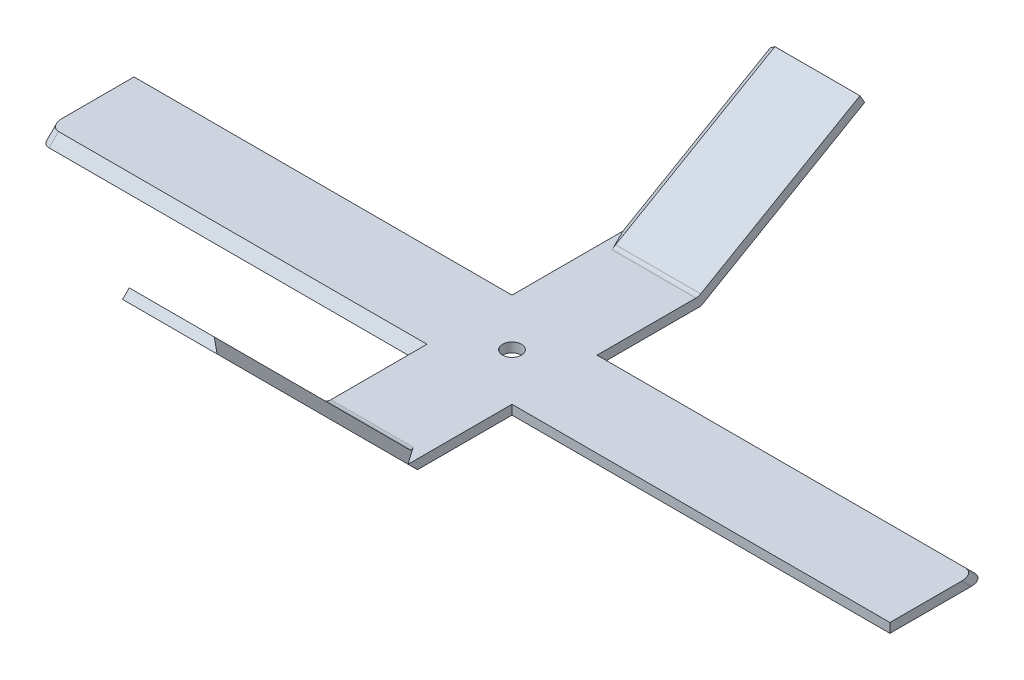
ISO-10303-21;
HEADER;
FILE_DESCRIPTION(('STEP AP214'),'2;1');
FILE_NAME('part.step','',(''),(''),'','','');
FILE_SCHEMA(('AUTOMOTIVE_DESIGN { 1 0 10303 214 1 1 1 1 }'));
ENDSEC;
DATA;
#1=APPLICATION_CONTEXT('core data for automotive mechanical design processes');
#2=APPLICATION_PROTOCOL_DEFINITION('international standard','automotive_design',2000,#1);
#3=PRODUCT_CONTEXT('',#1,'mechanical');
#4=PRODUCT('Part','Part','',(#3));
#5=PRODUCT_RELATED_PRODUCT_CATEGORY('part','',(#4));
#6=PRODUCT_DEFINITION_FORMATION('','',#4);
#7=PRODUCT_DEFINITION_CONTEXT('part definition',#1,'design');
#8=PRODUCT_DEFINITION('design','',#6,#7);
#9=PRODUCT_DEFINITION_SHAPE('','',#8);
#10=(LENGTH_UNIT() NAMED_UNIT(*) SI_UNIT(.MILLI.,.METRE.));
#11=(NAMED_UNIT(*) PLANE_ANGLE_UNIT() SI_UNIT($,.RADIAN.));
#12=(NAMED_UNIT(*) SI_UNIT($,.STERADIAN.) SOLID_ANGLE_UNIT());
#13=UNCERTAINTY_MEASURE_WITH_UNIT(LENGTH_MEASURE(1.E-05),#10,'distance_accuracy_value','');
#14=(GEOMETRIC_REPRESENTATION_CONTEXT(3) GLOBAL_UNCERTAINTY_ASSIGNED_CONTEXT((#13)) GLOBAL_UNIT_ASSIGNED_CONTEXT((#10,
#11,#12)) REPRESENTATION_CONTEXT('',''));
#15=CARTESIAN_POINT('',(0.,0.,0.));
#16=DIRECTION('',(0.,0.,1.));
#17=DIRECTION('',(1.,0.,0.));
#18=AXIS2_PLACEMENT_3D('',#15,#16,#17);
#19=CARTESIAN_POINT('',(10.,0.,0.));
#20=DIRECTION('',(-1.,0.,0.));
#21=DIRECTION('',(0.,0.,1.));
#22=AXIS2_PLACEMENT_3D('',#19,#20,#21);
#23=PLANE('',#22);
#24=DIRECTION('',(0.,0.,1.));
#25=VECTOR('',#24,1.);
#26=CARTESIAN_POINT('',(10.,1.,13.8404448227201));
#27=LINE('',#26,#25);
#28=CARTESIAN_POINT('',(10.,1.,4.25465838509315));
#29=VERTEX_POINT('',#28);
#30=CARTESIAN_POINT('',(10.,1.,15.2546583850932));
#31=VERTEX_POINT('',#30);
#32=EDGE_CURVE('E199',#29,#31,#27,.T.);
#33=ORIENTED_EDGE('',*,*,#32,.T.);
#34=DIRECTION('',(0.,-0.707106781186544,-0.707106781186551));
#35=VECTOR('',#34,1.);
#36=CARTESIAN_POINT('',(10.,0.,14.2546583850932));
#37=LINE('',#36,#35);
#38=CARTESIAN_POINT('',(10.,0.,14.2546583850932));
#39=VERTEX_POINT('',#38);
#40=EDGE_CURVE('E383',#31,#39,#37,.T.);
#41=ORIENTED_EDGE('',*,*,#40,.T.);
#42=DIRECTION('',(0.,0.,-1.));
#43=VECTOR('',#42,1.);
#44=CARTESIAN_POINT('',(10.,0.,14.2546583850932));
#45=LINE('',#44,#43);
#46=CARTESIAN_POINT('',(10.,0.,4.25465838509315));
#47=VERTEX_POINT('',#46);
#48=EDGE_CURVE('E316',#39,#47,#45,.T.);
#49=ORIENTED_EDGE('',*,*,#48,.T.);
#50=DIRECTION('',(0.,-1.,0.));
#51=VECTOR('',#50,1.);
#52=CARTESIAN_POINT('',(10.,1.,4.25465838509315));
#53=LINE('',#52,#51);
#54=EDGE_CURVE('E193',#29,#47,#53,.T.);
#55=ORIENTED_EDGE('',*,*,#54,.F.);
#56=EDGE_LOOP('',(#33,#41,#49,#55));
#57=FACE_BOUND('',#56,.T.);
#58=ADVANCED_FACE('F32',(#57),#23,.F.);
#59=CARTESIAN_POINT('',(0.,0.,0.));
#60=DIRECTION('',(-1.,0.,0.));
#61=DIRECTION('',(0.,0.,1.));
#62=AXIS2_PLACEMENT_3D('',#59,#60,#61);
#63=PLANE('',#62);
#64=DIRECTION('',(0.,0.,1.));
#65=VECTOR('',#64,1.);
#66=CARTESIAN_POINT('',(0.,1.,13.8404448227201));
#67=LINE('',#66,#65);
#68=CARTESIAN_POINT('',(0.,1.,3.25465838509315));
#69=VERTEX_POINT('',#68);
#70=CARTESIAN_POINT('',(0.,1.,13.426231260347));
#71=VERTEX_POINT('',#70);
#72=EDGE_CURVE('E359',#69,#71,#67,.T.);
#73=ORIENTED_EDGE('',*,*,#72,.F.);
#74=DIRECTION('',(0.,-0.707106781186543,0.707106781186553));
#75=VECTOR('',#74,1.);
#76=CARTESIAN_POINT('',(0.,0.,4.25465838509315));
#77=LINE('',#76,#75);
#78=CARTESIAN_POINT('',(0.,0.,4.25465838509315));
#79=VERTEX_POINT('',#78);
#80=EDGE_CURVE('E226',#69,#79,#77,.T.);
#81=ORIENTED_EDGE('',*,*,#80,.T.);
#82=DIRECTION('',(0.,0.,-1.));
#83=VECTOR('',#82,1.);
#84=CARTESIAN_POINT('',(0.,0.,14.2546583850932));
#85=LINE('',#84,#83);
#86=CARTESIAN_POINT('',(0.,0.,14.2546583850932));
#87=VERTEX_POINT('',#86);
#88=EDGE_CURVE('E375',#87,#79,#85,.T.);
#89=ORIENTED_EDGE('',*,*,#88,.F.);
#90=DIRECTION('',(0.,-0.707106781186544,-0.707106781186551));
#91=VECTOR('',#90,1.);
#92=CARTESIAN_POINT('',(0.,0.,14.2546583850932));
#93=LINE('',#92,#91);
#94=CARTESIAN_POINT('',(0.,21.2132034355963,35.4678618206897));
#95=VERTEX_POINT('',#94);
#96=EDGE_CURVE('E274',#95,#87,#93,.T.);
#97=ORIENTED_EDGE('',*,*,#96,.F.);
#98=DIRECTION('',(0.,-0.707106781186556,0.707106781186539));
#99=VECTOR('',#98,1.);
#100=CARTESIAN_POINT('',(0.,21.2132034355963,35.4678618206897));
#101=LINE('',#100,#99);
#102=CARTESIAN_POINT('',(0.,21.9203102167829,34.7607550395032));
#103=VERTEX_POINT('',#102);
#104=EDGE_CURVE('E381',#103,#95,#101,.T.);
#105=ORIENTED_EDGE('',*,*,#104,.F.);
#106=DIRECTION('',(0.,0.707106781186544,0.707106781186551));
#107=VECTOR('',#106,1.);
#108=CARTESIAN_POINT('',(0.,1.,13.8404448227201));
#109=LINE('',#108,#107);
#110=CARTESIAN_POINT('',(0.,1.29289321881345,14.1333380415335));
#111=VERTEX_POINT('',#110);
#112=EDGE_CURVE('E362',#111,#103,#109,.T.);
#113=ORIENTED_EDGE('',*,*,#112,.F.);
#114=CARTESIAN_POINT('',(0.,2.,13.426231260347));
#115=DIRECTION('',(-1.,0.,0.));
#116=DIRECTION('',(0.,0.,1.));
#117=AXIS2_PLACEMENT_3D('',#114,#115,#116);
#118=CIRCLE('',#117,1.);
#119=EDGE_CURVE('E338',#111,#71,#118,.F.);
#120=ORIENTED_EDGE('',*,*,#119,.T.);
#121=EDGE_LOOP('',(#73,#81,#89,#97,#105,#113,#120));
#122=FACE_BOUND('',#121,.T.);
#123=ADVANCED_FACE('F358',(#122),#63,.T.);
#124=CARTESIAN_POINT('',(10.,0.,14.2546583850932));
#125=DIRECTION('',(0.,0.707106781186551,-0.707106781186544));
#126=DIRECTION('',(0.,0.707106781186544,0.707106781186551));
#127=AXIS2_PLACEMENT_3D('',#124,#125,#126);
#128=PLANE('',#127);
#129=ORIENTED_EDGE('',*,*,#96,.T.);
#130=DIRECTION('',(-1.,0.,0.));
#131=VECTOR('',#130,1.);
#132=CARTESIAN_POINT('',(10.,0.,14.2546583850932));
#133=LINE('',#132,#131);
#134=EDGE_CURVE('E215',#39,#87,#133,.T.);
#135=ORIENTED_EDGE('',*,*,#134,.F.);
#136=ORIENTED_EDGE('',*,*,#40,.F.);
#137=CARTESIAN_POINT('',(10.,21.2132034355963,35.4678618206897));
#138=VERTEX_POINT('',#137);
#139=EDGE_CURVE('E321',#138,#31,#37,.T.);
#140=ORIENTED_EDGE('',*,*,#139,.F.);
#141=DIRECTION('',(-1.,0.,0.));
#142=VECTOR('',#141,1.);
#143=CARTESIAN_POINT('',(10.,21.2132034355963,35.4678618206897));
#144=LINE('',#143,#142);
#145=EDGE_CURVE('E267',#138,#95,#144,.T.);
#146=ORIENTED_EDGE('',*,*,#145,.T.);
#147=EDGE_LOOP('',(#129,#135,#136,#140,#146));
#148=FACE_BOUND('',#147,.T.);
#149=ADVANCED_FACE('F405',(#148),#128,.F.);
#150=CARTESIAN_POINT('',(10.,0.,14.2546583850932));
#151=DIRECTION('',(0.,1.,0.));
#152=DIRECTION('',(0.,0.,1.));
#153=AXIS2_PLACEMENT_3D('',#150,#151,#152);
#154=PLANE('',#153);
#155=CARTESIAN_POINT('',(5.,0.,-0.745341614906845));
#156=DIRECTION('',(0.,-1.,0.));
#157=DIRECTION('',(0.,0.,-1.));
#158=AXIS2_PLACEMENT_3D('',#155,#156,#157);
#159=CIRCLE('',#158,1.);
#160=CARTESIAN_POINT('',(5.,0.,-1.74534161490685));
#161=VERTEX_POINT('',#160);
#162=EDGE_CURVE('E260',#161,#161,#159,.T.);
#163=ORIENTED_EDGE('',*,*,#162,.F.);
#164=EDGE_LOOP('',(#163));
#165=FACE_BOUND('',#164,.T.);
#166=DIRECTION('',(1.,0.,0.));
#167=VECTOR('',#166,1.);
#168=CARTESIAN_POINT('',(50.,0.,-5.74534161490684));
#169=LINE('',#168,#167);
#170=CARTESIAN_POINT('',(10.,0.,-5.74534161490684));
#171=VERTEX_POINT('',#170);
#172=CARTESIAN_POINT('',(49.,0.,-5.74534161490684));
#173=VERTEX_POINT('',#172);
#174=EDGE_CURVE('E259',#171,#173,#169,.T.);
#175=ORIENTED_EDGE('',*,*,#174,.T.);
#176=CARTESIAN_POINT('',(49.,0.,-4.33112805253374));
#177=DIRECTION('',(0.,1.,0.));
#178=DIRECTION('',(0.,0.,1.));
#179=AXIS2_PLACEMENT_3D('',#176,#177,#178);
#180=ELLIPSE('',#179,1.41421356237311,1.);
#181=CARTESIAN_POINT('',(50.,0.,-4.33112805253374));
#182=VERTEX_POINT('',#181);
#183=EDGE_CURVE('E248',#173,#182,#180,.F.);
#184=ORIENTED_EDGE('',*,*,#183,.T.);
#185=DIRECTION('',(0.,0.,1.));
#186=VECTOR('',#185,1.);
#187=CARTESIAN_POINT('',(50.,0.,4.25465838509315));
#188=LINE('',#187,#186);
#189=CARTESIAN_POINT('',(50.,0.,4.25465838509315));
#190=VERTEX_POINT('',#189);
#191=EDGE_CURVE('E208',#182,#190,#188,.T.);
#192=ORIENTED_EDGE('',*,*,#191,.T.);
#193=DIRECTION('',(-1.,0.,0.));
#194=VECTOR('',#193,1.);
#195=CARTESIAN_POINT('',(10.,0.,4.25465838509315));
#196=LINE('',#195,#194);
#197=EDGE_CURVE('E187',#190,#47,#196,.T.);
#198=ORIENTED_EDGE('',*,*,#197,.T.);
#199=ORIENTED_EDGE('',*,*,#48,.F.);
#200=ORIENTED_EDGE('',*,*,#134,.T.);
#201=ORIENTED_EDGE('',*,*,#88,.T.);
#202=DIRECTION('',(-1.,0.,0.));
#203=VECTOR('',#202,1.);
#204=CARTESIAN_POINT('',(-40.,0.,4.25465838509315));
#205=LINE('',#204,#203);
#206=CARTESIAN_POINT('',(-39.,0.,4.25465838509315));
#207=VERTEX_POINT('',#206);
#208=EDGE_CURVE('E299',#79,#207,#205,.T.);
#209=ORIENTED_EDGE('',*,*,#208,.T.);
#210=CARTESIAN_POINT('',(-39.,0.,2.84044482272006));
#211=DIRECTION('',(0.,1.,0.));
#212=DIRECTION('',(0.,0.,-1.));
#213=AXIS2_PLACEMENT_3D('',#210,#211,#212);
#214=ELLIPSE('',#213,1.4142135623731,1.);
#215=CARTESIAN_POINT('',(-40.,0.,2.84044482272006));
#216=VERTEX_POINT('',#215);
#217=EDGE_CURVE('E246',#207,#216,#214,.F.);
#218=ORIENTED_EDGE('',*,*,#217,.T.);
#219=DIRECTION('',(0.,0.,-1.));
#220=VECTOR('',#219,1.);
#221=CARTESIAN_POINT('',(-40.,0.,-5.74534161490685));
#222=LINE('',#221,#220);
#223=CARTESIAN_POINT('',(-40.,0.,-5.74534161490685));
#224=VERTEX_POINT('',#223);
#225=EDGE_CURVE('E297',#216,#224,#222,.T.);
#226=ORIENTED_EDGE('',*,*,#225,.T.);
#227=DIRECTION('',(1.,0.,0.));
#228=VECTOR('',#227,1.);
#229=CARTESIAN_POINT('',(0.,0.,-5.74534161490684));
#230=LINE('',#229,#228);
#231=CARTESIAN_POINT('',(0.,0.,-5.74534161490684));
#232=VERTEX_POINT('',#231);
#233=EDGE_CURVE('E296',#224,#232,#230,.T.);
#234=ORIENTED_EDGE('',*,*,#233,.T.);
#235=CARTESIAN_POINT('',(0.,0.,-15.7453416149068));
#236=VERTEX_POINT('',#235);
#237=EDGE_CURVE('E408',#232,#236,#85,.T.);
#238=ORIENTED_EDGE('',*,*,#237,.T.);
#239=DIRECTION('',(-1.,0.,0.));
#240=VECTOR('',#239,1.);
#241=CARTESIAN_POINT('',(10.,0.,-15.7453416149068));
#242=LINE('',#241,#240);
#243=CARTESIAN_POINT('',(10.,0.,-15.7453416149068));
#244=VERTEX_POINT('',#243);
#245=EDGE_CURVE('E392',#244,#236,#242,.T.);
#246=ORIENTED_EDGE('',*,*,#245,.F.);
#247=EDGE_CURVE('E280',#171,#244,#45,.T.);
#248=ORIENTED_EDGE('',*,*,#247,.F.);
#249=EDGE_LOOP('',(#175,#184,#192,#198,#199,#200,#201,#209,#218,#226,#234,#238,#246,#248));
#250=FACE_BOUND('',#249,.T.);
#251=ADVANCED_FACE('F399',(#165,#250),#154,.F.);
#252=CARTESIAN_POINT('',(10.,0.,-15.7453416149068));
#253=DIRECTION('',(0.,0.866025403784438,0.500000000000001));
#254=DIRECTION('',(0.,-0.500000000000001,0.866025403784438));
#255=AXIS2_PLACEMENT_3D('',#252,#253,#254);
#256=PLANE('',#255);
#257=DIRECTION('',(0.,0.500000000000001,-0.866025403784438));
#258=VECTOR('',#257,1.);
#259=CARTESIAN_POINT('',(0.,0.,-15.7453416149068));
#260=LINE('',#259,#258);
#261=CARTESIAN_POINT('',(0.,0.999999999999997,-17.4773924224757));
#262=VERTEX_POINT('',#261);
#263=EDGE_CURVE('E365',#236,#262,#260,.T.);
#264=ORIENTED_EDGE('',*,*,#263,.T.);
#265=CARTESIAN_POINT('',(0.,10.,-33.0658496905956));
#266=VERTEX_POINT('',#265);
#267=EDGE_CURVE('E370',#262,#266,#260,.T.);
#268=ORIENTED_EDGE('',*,*,#267,.T.);
#269=DIRECTION('',(-1.,0.,0.));
#270=VECTOR('',#269,1.);
#271=CARTESIAN_POINT('',(10.,10.,-33.0658496905956));
#272=LINE('',#271,#270);
#273=CARTESIAN_POINT('',(10.,10.,-33.0658496905956));
#274=VERTEX_POINT('',#273);
#275=EDGE_CURVE('E389',#274,#266,#272,.T.);
#276=ORIENTED_EDGE('',*,*,#275,.F.);
#277=DIRECTION('',(0.,0.500000000000001,-0.866025403784438));
#278=VECTOR('',#277,1.);
#279=CARTESIAN_POINT('',(10.,0.,-15.7453416149068));
#280=LINE('',#279,#278);
#281=EDGE_CURVE('E318',#244,#274,#280,.T.);
#282=ORIENTED_EDGE('',*,*,#281,.F.);
#283=ORIENTED_EDGE('',*,*,#245,.T.);
#284=EDGE_LOOP('',(#264,#268,#276,#282,#283));
#285=FACE_BOUND('',#284,.T.);
#286=ADVANCED_FACE('F420',(#285),#256,.F.);
#287=CARTESIAN_POINT('',(10.,10.8660254037844,-32.5658496905956));
#288=DIRECTION('',(0.,-0.499999999999999,0.866025403784439));
#289=DIRECTION('',(0.,-0.866025403784439,-0.499999999999999));
#290=AXIS2_PLACEMENT_3D('',#287,#288,#289);
#291=PLANE('',#290);
#292=ORIENTED_EDGE('',*,*,#275,.T.);
#293=DIRECTION('',(0.707106781186545,0.612372435695797,0.353553390593275));
#294=VECTOR('',#293,1.);
#295=CARTESIAN_POINT('',(0.999999999999978,10.8660254037844,-32.5658496905956));
#296=LINE('',#295,#294);
#297=CARTESIAN_POINT('',(0.999999999999988,10.8660254037844,-32.5658496905956));
#298=VERTEX_POINT('',#297);
#299=EDGE_CURVE('E219',#266,#298,#296,.T.);
#300=ORIENTED_EDGE('',*,*,#299,.T.);
#301=DIRECTION('',(-1.,0.,0.));
#302=VECTOR('',#301,1.);
#303=CARTESIAN_POINT('',(10.,10.8660254037844,-32.5658496905956));
#304=LINE('',#303,#302);
#305=CARTESIAN_POINT('',(10.,10.8660254037844,-32.5658496905956));
#306=VERTEX_POINT('',#305);
#307=EDGE_CURVE('E387',#306,#298,#304,.T.);
#308=ORIENTED_EDGE('',*,*,#307,.F.);
#309=DIRECTION('',(0.,0.866025403784439,0.499999999999999));
#310=VECTOR('',#309,1.);
#311=CARTESIAN_POINT('',(10.,10.8660254037844,-32.5658496905956));
#312=LINE('',#311,#310);
#313=EDGE_CURVE('E323',#274,#306,#312,.T.);
#314=ORIENTED_EDGE('',*,*,#313,.F.);
#315=EDGE_LOOP('',(#292,#300,#308,#314));
#316=FACE_BOUND('',#315,.T.);
#317=ADVANCED_FACE('F424',(#316),#291,.F.);
#318=CARTESIAN_POINT('',(10.,1.,-15.4773924224757));
#319=DIRECTION('',(0.,-0.866025403784439,-0.5));
#320=DIRECTION('',(0.,0.5,-0.866025403784439));
#321=AXIS2_PLACEMENT_3D('',#318,#319,#320);
#322=PLANE('',#321);
#323=DIRECTION('',(0.,-0.5,0.866025403784439));
#324=VECTOR('',#323,1.);
#325=CARTESIAN_POINT('',(0.999999999999987,0.999999999999999,-15.4773924224757));
#326=LINE('',#325,#324);
#327=CARTESIAN_POINT('',(0.999999999999987,1.13397459621556,-15.7094432300446));
#328=VERTEX_POINT('',#327);
#329=EDGE_CURVE('E217',#298,#328,#326,.T.);
#330=ORIENTED_EDGE('',*,*,#329,.T.);
#331=DIRECTION('',(-1.,0.,0.));
#332=VECTOR('',#331,1.);
#333=CARTESIAN_POINT('',(10.,1.13397459621556,-15.7094432300446));
#334=LINE('',#333,#332);
#335=CARTESIAN_POINT('',(10.,1.13397459621556,-15.7094432300446));
#336=VERTEX_POINT('',#335);
#337=EDGE_CURVE('E47',#328,#336,#334,.F.);
#338=ORIENTED_EDGE('',*,*,#337,.T.);
#339=DIRECTION('',(0.,-0.5,0.866025403784438));
#340=VECTOR('',#339,1.);
#341=CARTESIAN_POINT('',(10.,1.,-15.4773924224757));
#342=LINE('',#341,#340);
#343=EDGE_CURVE('E272',#306,#336,#342,.T.);
#344=ORIENTED_EDGE('',*,*,#343,.F.);
#345=ORIENTED_EDGE('',*,*,#307,.T.);
#346=EDGE_LOOP('',(#330,#338,#344,#345));
#347=FACE_BOUND('',#346,.T.);
#348=ADVANCED_FACE('F425',(#347),#322,.F.);
#349=CARTESIAN_POINT('',(10.,1.,13.8404448227201));
#350=DIRECTION('',(0.,-1.,0.));
#351=DIRECTION('',(0.,0.,-1.));
#352=AXIS2_PLACEMENT_3D('',#349,#350,#351);
#353=PLANE('',#352);
#354=CARTESIAN_POINT('',(5.,1.,-0.745341614906845));
#355=DIRECTION('',(0.,-1.,0.));
#356=DIRECTION('',(0.,0.,-1.));
#357=AXIS2_PLACEMENT_3D('',#354,#355,#356);
#358=CIRCLE('',#357,1.);
#359=CARTESIAN_POINT('',(5.,1.,-1.74534161490685));
#360=VERTEX_POINT('',#359);
#361=EDGE_CURVE('E256',#360,#360,#358,.T.);
#362=ORIENTED_EDGE('',*,*,#361,.T.);
#363=EDGE_LOOP('',(#362));
#364=FACE_BOUND('',#363,.T.);
#365=ORIENTED_EDGE('',*,*,#72,.T.);
#366=DIRECTION('',(-1.,0.,0.));
#367=VECTOR('',#366,1.);
#368=CARTESIAN_POINT('',(9.,1.,13.426231260347));
#369=LINE('',#368,#367);
#370=CARTESIAN_POINT('',(8.70710678118655,1.,13.426231260347));
#371=VERTEX_POINT('',#370);
#372=EDGE_CURVE('E334',#71,#371,#369,.F.);
#373=ORIENTED_EDGE('',*,*,#372,.T.);
#374=DIRECTION('',(-0.577350269189623,0.,-0.816496580927728));
#375=VECTOR('',#374,1.);
#376=CARTESIAN_POINT('',(9.33333333333333,1.,14.3118493435111));
#377=LINE('',#376,#375);
#378=EDGE_CURVE('E235',#371,#31,#377,.F.);
#379=ORIENTED_EDGE('',*,*,#378,.T.);
#380=ORIENTED_EDGE('',*,*,#32,.F.);
#381=DIRECTION('',(-1.,0.,0.));
#382=VECTOR('',#381,1.);
#383=CARTESIAN_POINT('',(10.,1.,4.25465838509315));
#384=LINE('',#383,#382);
#385=CARTESIAN_POINT('',(50.,1.,4.25465838509315));
#386=VERTEX_POINT('',#385);
#387=EDGE_CURVE('E186',#386,#29,#384,.T.);
#388=ORIENTED_EDGE('',*,*,#387,.F.);
#389=DIRECTION('',(0.,0.,1.));
#390=VECTOR('',#389,1.);
#391=CARTESIAN_POINT('',(50.,1.,4.25465838509315));
#392=LINE('',#391,#390);
#393=CARTESIAN_POINT('',(50.,1.,-3.33112805253373));
#394=VERTEX_POINT('',#393);
#395=EDGE_CURVE('E176',#394,#386,#392,.T.);
#396=ORIENTED_EDGE('',*,*,#395,.F.);
#397=CARTESIAN_POINT('',(49.,1.,-3.33112805253373));
#398=DIRECTION('',(0.,-1.,0.));
#399=DIRECTION('',(0.,0.,1.));
#400=AXIS2_PLACEMENT_3D('',#397,#398,#399);
#401=ELLIPSE('',#400,1.41421356237311,1.);
#402=CARTESIAN_POINT('',(49.,1.,-4.74534161490683));
#403=VERTEX_POINT('',#402);
#404=EDGE_CURVE('E242',#394,#403,#401,.F.);
#405=ORIENTED_EDGE('',*,*,#404,.T.);
#406=DIRECTION('',(-1.,0.,0.));
#407=VECTOR('',#406,1.);
#408=CARTESIAN_POINT('',(10.,1.,-4.74534161490684));
#409=LINE('',#408,#407);
#410=CARTESIAN_POINT('',(10.,1.,-4.74534161490684));
#411=VERTEX_POINT('',#410);
#412=EDGE_CURVE('E211',#403,#411,#409,.T.);
#413=ORIENTED_EDGE('',*,*,#412,.T.);
#414=CARTESIAN_POINT('',(10.,1.,-15.2094432300446));
#415=VERTEX_POINT('',#414);
#416=EDGE_CURVE('E264',#415,#411,#27,.T.);
#417=ORIENTED_EDGE('',*,*,#416,.F.);
#418=DIRECTION('',(-1.,0.,0.));
#419=VECTOR('',#418,1.);
#420=CARTESIAN_POINT('',(0.999999999999987,1.,-15.2094432300446));
#421=LINE('',#420,#419);
#422=CARTESIAN_POINT('',(1.13397459621554,1.,-15.2094432300446));
#423=VERTEX_POINT('',#422);
#424=EDGE_CURVE('E263',#415,#423,#421,.T.);
#425=ORIENTED_EDGE('',*,*,#424,.T.);
#426=DIRECTION('',(-0.447213595499956,0.,-0.894427190999917));
#427=VECTOR('',#426,1.);
#428=CARTESIAN_POINT('',(14.5271348980782,1.,11.576877373681));
#429=LINE('',#428,#427);
#430=EDGE_CURVE('E228',#423,#262,#429,.T.);
#431=ORIENTED_EDGE('',*,*,#430,.T.);
#432=CARTESIAN_POINT('',(0.,1.,-5.74534161490684));
#433=VERTEX_POINT('',#432);
#434=EDGE_CURVE('E364',#262,#433,#67,.T.);
#435=ORIENTED_EDGE('',*,*,#434,.T.);
#436=DIRECTION('',(1.,0.,0.));
#437=VECTOR('',#436,1.);
#438=CARTESIAN_POINT('',(0.,1.,-5.74534161490684));
#439=LINE('',#438,#437);
#440=CARTESIAN_POINT('',(-40.,1.,-5.74534161490685));
#441=VERTEX_POINT('',#440);
#442=EDGE_CURVE('E295',#441,#433,#439,.T.);
#443=ORIENTED_EDGE('',*,*,#442,.F.);
#444=DIRECTION('',(0.,0.,-1.));
#445=VECTOR('',#444,1.);
#446=CARTESIAN_POINT('',(-40.,1.,-5.74534161490685));
#447=LINE('',#446,#445);
#448=CARTESIAN_POINT('',(-40.,1.,1.84044482272004));
#449=VERTEX_POINT('',#448);
#450=EDGE_CURVE('E293',#449,#441,#447,.T.);
#451=ORIENTED_EDGE('',*,*,#450,.F.);
#452=CARTESIAN_POINT('',(-39.,1.,1.84044482272004));
#453=DIRECTION('',(0.,-1.,0.));
#454=DIRECTION('',(0.,0.,-1.));
#455=AXIS2_PLACEMENT_3D('',#452,#453,#454);
#456=ELLIPSE('',#455,1.4142135623731,1.);
#457=CARTESIAN_POINT('',(-39.,1.,3.25465838509315));
#458=VERTEX_POINT('',#457);
#459=EDGE_CURVE('E240',#449,#458,#456,.F.);
#460=ORIENTED_EDGE('',*,*,#459,.T.);
#461=DIRECTION('',(1.,0.,0.));
#462=VECTOR('',#461,1.);
#463=CARTESIAN_POINT('',(0.,1.,3.25465838509315));
#464=LINE('',#463,#462);
#465=EDGE_CURVE('E214',#458,#69,#464,.T.);
#466=ORIENTED_EDGE('',*,*,#465,.T.);
#467=EDGE_LOOP('',(#365,#373,#379,#380,#388,#396,#405,#413,#417,#425,#431,#435,#443,#451,#460,#466));
#468=FACE_BOUND('',#467,.T.);
#469=ADVANCED_FACE('F197',(#364,#468),#353,.F.);
#470=CARTESIAN_POINT('',(10.,1.,13.8404448227201));
#471=DIRECTION('',(0.,-0.707106781186551,0.707106781186544));
#472=DIRECTION('',(0.,-0.707106781186544,-0.707106781186551));
#473=AXIS2_PLACEMENT_3D('',#470,#471,#472);
#474=PLANE('',#473);
#475=DIRECTION('',(0.,-0.707106781186544,-0.707106781186551));
#476=VECTOR('',#475,1.);
#477=CARTESIAN_POINT('',(9.,1.,13.8404448227201));
#478=LINE('',#477,#476);
#479=CARTESIAN_POINT('',(9.,21.9203102167829,34.7607550395032));
#480=VERTEX_POINT('',#479);
#481=CARTESIAN_POINT('',(9.,1.29289321881345,14.1333380415335));
#482=VERTEX_POINT('',#481);
#483=EDGE_CURVE('E223',#480,#482,#478,.T.);
#484=ORIENTED_EDGE('',*,*,#483,.T.);
#485=DIRECTION('',(-1.,0.,0.));
#486=VECTOR('',#485,1.);
#487=CARTESIAN_POINT('',(0.,1.29289321881345,14.1333380415335));
#488=LINE('',#487,#486);
#489=EDGE_CURVE('E255',#482,#111,#488,.T.);
#490=ORIENTED_EDGE('',*,*,#489,.T.);
#491=ORIENTED_EDGE('',*,*,#112,.T.);
#492=DIRECTION('',(-1.,0.,0.));
#493=VECTOR('',#492,1.);
#494=CARTESIAN_POINT('',(10.,21.9203102167829,34.7607550395032));
#495=LINE('',#494,#493);
#496=EDGE_CURVE('E354',#480,#103,#495,.T.);
#497=ORIENTED_EDGE('',*,*,#496,.F.);
#498=EDGE_LOOP('',(#484,#490,#491,#497));
#499=FACE_BOUND('',#498,.T.);
#500=ADVANCED_FACE('F351',(#499),#474,.F.);
#501=CARTESIAN_POINT('',(10.,21.2132034355963,35.4678618206897));
#502=DIRECTION('',(0.,-0.707106781186539,-0.707106781186556));
#503=DIRECTION('',(0.,0.707106781186556,-0.707106781186539));
#504=AXIS2_PLACEMENT_3D('',#501,#502,#503);
#505=PLANE('',#504);
#506=ORIENTED_EDGE('',*,*,#145,.F.);
#507=DIRECTION('',(0.707106781186547,-0.500000000000007,0.499999999999995));
#508=VECTOR('',#507,1.);
#509=CARTESIAN_POINT('',(10.0000000000001,21.2132034355962,35.4678618206898));
#510=LINE('',#509,#508);
#511=EDGE_CURVE('E221',#138,#480,#510,.F.);
#512=ORIENTED_EDGE('',*,*,#511,.T.);
#513=ORIENTED_EDGE('',*,*,#496,.T.);
#514=ORIENTED_EDGE('',*,*,#104,.T.);
#515=EDGE_LOOP('',(#506,#512,#513,#514));
#516=FACE_BOUND('',#515,.T.);
#517=ADVANCED_FACE('F466',(#516),#505,.F.);
#518=ORIENTED_EDGE('',*,*,#343,.T.);
#519=CARTESIAN_POINT('',(10.,2.,-15.2094432300446));
#520=DIRECTION('',(-1.,0.,0.));
#521=DIRECTION('',(0.,0.,1.));
#522=AXIS2_PLACEMENT_3D('',#519,#520,#521);
#523=CIRCLE('',#522,1.);
#524=EDGE_CURVE('E11',#336,#415,#523,.T.);
#525=ORIENTED_EDGE('',*,*,#524,.T.);
#526=ORIENTED_EDGE('',*,*,#416,.T.);
#527=DIRECTION('',(0.,-0.707106781186542,-0.707106781186553));
#528=VECTOR('',#527,1.);
#529=CARTESIAN_POINT('',(10.,2.87267080745343,-2.87267080745338));
#530=LINE('',#529,#528);
#531=EDGE_CURVE('E233',#411,#171,#530,.T.);
#532=ORIENTED_EDGE('',*,*,#531,.T.);
#533=ORIENTED_EDGE('',*,*,#247,.T.);
#534=ORIENTED_EDGE('',*,*,#281,.T.);
#535=ORIENTED_EDGE('',*,*,#313,.T.);
#536=EDGE_LOOP('',(#518,#525,#526,#532,#533,#534,#535));
#537=FACE_BOUND('',#536,.T.);
#538=ADVANCED_FACE('F328',(#537),#23,.F.);
#539=ORIENTED_EDGE('',*,*,#434,.F.);
#540=ORIENTED_EDGE('',*,*,#263,.F.);
#541=ORIENTED_EDGE('',*,*,#237,.F.);
#542=DIRECTION('',(0.,-1.,0.));
#543=VECTOR('',#542,1.);
#544=CARTESIAN_POINT('',(0.,1.,-5.74534161490684));
#545=LINE('',#544,#543);
#546=EDGE_CURVE('E305',#433,#232,#545,.T.);
#547=ORIENTED_EDGE('',*,*,#546,.F.);
#548=EDGE_LOOP('',(#539,#540,#541,#547));
#549=FACE_BOUND('',#548,.T.);
#550=ADVANCED_FACE('F429',(#549),#63,.T.);
#551=CARTESIAN_POINT('',(0.,1.,-5.74534161490684));
#552=DIRECTION('',(0.,0.,-1.));
#553=DIRECTION('',(-1.,0.,0.));
#554=AXIS2_PLACEMENT_3D('',#551,#552,#553);
#555=PLANE('',#554);
#556=ORIENTED_EDGE('',*,*,#233,.F.);
#557=DIRECTION('',(0.,-1.,0.));
#558=VECTOR('',#557,1.);
#559=CARTESIAN_POINT('',(-40.,1.,-5.74534161490685));
#560=LINE('',#559,#558);
#561=EDGE_CURVE('E302',#441,#224,#560,.T.);
#562=ORIENTED_EDGE('',*,*,#561,.F.);
#563=ORIENTED_EDGE('',*,*,#442,.T.);
#564=ORIENTED_EDGE('',*,*,#546,.T.);
#565=EDGE_LOOP('',(#556,#562,#563,#564));
#566=FACE_BOUND('',#565,.T.);
#567=ADVANCED_FACE('F433',(#566),#555,.T.);
#568=CARTESIAN_POINT('',(-40.,1.,-5.74534161490685));
#569=DIRECTION('',(-1.,0.,0.));
#570=DIRECTION('',(0.,0.,1.));
#571=AXIS2_PLACEMENT_3D('',#568,#569,#570);
#572=PLANE('',#571);
#573=ORIENTED_EDGE('',*,*,#225,.F.);
#574=DIRECTION('',(0.,0.707106781186543,-0.707106781186553));
#575=VECTOR('',#574,1.);
#576=CARTESIAN_POINT('',(-40.,4.79289321881345,-1.95244839609346));
#577=LINE('',#576,#575);
#578=EDGE_CURVE('E250',#216,#449,#577,.T.);
#579=ORIENTED_EDGE('',*,*,#578,.T.);
#580=ORIENTED_EDGE('',*,*,#450,.T.);
#581=ORIENTED_EDGE('',*,*,#561,.T.);
#582=EDGE_LOOP('',(#573,#579,#580,#581));
#583=FACE_BOUND('',#582,.T.);
#584=ADVANCED_FACE('F439',(#583),#572,.T.);
#585=CARTESIAN_POINT('',(10.,1.,4.25465838509315));
#586=DIRECTION('',(0.,0.,1.));
#587=DIRECTION('',(1.,0.,0.));
#588=AXIS2_PLACEMENT_3D('',#585,#586,#587);
#589=PLANE('',#588);
#590=ORIENTED_EDGE('',*,*,#197,.F.);
#591=DIRECTION('',(0.,-1.,0.));
#592=VECTOR('',#591,1.);
#593=CARTESIAN_POINT('',(50.,1.,4.25465838509315));
#594=LINE('',#593,#592);
#595=EDGE_CURVE('E180',#386,#190,#594,.T.);
#596=ORIENTED_EDGE('',*,*,#595,.F.);
#597=ORIENTED_EDGE('',*,*,#387,.T.);
#598=ORIENTED_EDGE('',*,*,#54,.T.);
#599=EDGE_LOOP('',(#590,#596,#597,#598));
#600=FACE_BOUND('',#599,.T.);
#601=ADVANCED_FACE('F190',(#600),#589,.T.);
#602=CARTESIAN_POINT('',(50.,1.,4.25465838509315));
#603=DIRECTION('',(1.,0.,0.));
#604=DIRECTION('',(0.,0.,-1.));
#605=AXIS2_PLACEMENT_3D('',#602,#603,#604);
#606=PLANE('',#605);
#607=ORIENTED_EDGE('',*,*,#191,.F.);
#608=DIRECTION('',(0.,0.707106781186542,0.707106781186553));
#609=VECTOR('',#608,1.);
#610=CARTESIAN_POINT('',(50.,4.79289321881344,0.46176516627977));
#611=LINE('',#610,#609);
#612=EDGE_CURVE('E183',#182,#394,#611,.T.);
#613=ORIENTED_EDGE('',*,*,#612,.T.);
#614=ORIENTED_EDGE('',*,*,#395,.T.);
#615=ORIENTED_EDGE('',*,*,#595,.T.);
#616=EDGE_LOOP('',(#607,#613,#614,#615));
#617=FACE_BOUND('',#616,.T.);
#618=ADVANCED_FACE('F179',(#617),#606,.T.);
#619=CARTESIAN_POINT('',(-40.,0.,4.25465838509315));
#620=DIRECTION('',(0.,0.707106781186552,0.707106781186542));
#621=DIRECTION('',(1.,0.,0.));
#622=AXIS2_PLACEMENT_3D('',#619,#620,#621);
#623=PLANE('',#622);
#624=ORIENTED_EDGE('',*,*,#465,.F.);
#625=DIRECTION('',(0.,0.707106781186543,-0.707106781186553));
#626=VECTOR('',#625,1.);
#627=CARTESIAN_POINT('',(-39.,0.,4.25465838509315));
#628=LINE('',#627,#626);
#629=EDGE_CURVE('E253',#458,#207,#628,.F.);
#630=ORIENTED_EDGE('',*,*,#629,.T.);
#631=ORIENTED_EDGE('',*,*,#208,.F.);
#632=ORIENTED_EDGE('',*,*,#80,.F.);
#633=EDGE_LOOP('',(#624,#630,#631,#632));
#634=FACE_BOUND('',#633,.T.);
#635=ADVANCED_FACE('F444',(#634),#623,.T.);
#636=CARTESIAN_POINT('',(0.999999999999987,1.,-15.4773924224757));
#637=DIRECTION('',(-0.70710678118655,0.612372435695792,0.353553390593273));
#638=DIRECTION('',(0.,0.5,-0.866025403784439));
#639=AXIS2_PLACEMENT_3D('',#636,#637,#638);
#640=PLANE('',#639);
#641=ORIENTED_EDGE('',*,*,#299,.F.);
#642=ORIENTED_EDGE('',*,*,#267,.F.);
#643=ORIENTED_EDGE('',*,*,#430,.F.);
#644=CARTESIAN_POINT('',(1.99999999999998,2.,-15.2094432300446));
#645=DIRECTION('',(-0.70710678118655,0.612372435695792,0.353553390593273));
#646=DIRECTION('',(0.707106781186545,0.612372435695797,0.353553390593275));
#647=AXIS2_PLACEMENT_3D('',#644,#645,#646);
#648=ELLIPSE('',#647,1.41421356237309,1.);
#649=EDGE_CURVE('E40',#423,#328,#648,.F.);
#650=ORIENTED_EDGE('',*,*,#649,.T.);
#651=ORIENTED_EDGE('',*,*,#329,.F.);
#652=EDGE_LOOP('',(#641,#642,#643,#650,#651));
#653=FACE_BOUND('',#652,.T.);
#654=ADVANCED_FACE('F426',(#653),#640,.T.);
#655=CARTESIAN_POINT('',(50.,0.,-5.74534161490684));
#656=DIRECTION('',(0.,0.707106781186553,-0.707106781186542));
#657=DIRECTION('',(-1.,0.,0.));
#658=AXIS2_PLACEMENT_3D('',#655,#656,#657);
#659=PLANE('',#658);
#660=ORIENTED_EDGE('',*,*,#412,.F.);
#661=DIRECTION('',(0.,0.707106781186542,0.707106781186553));
#662=VECTOR('',#661,1.);
#663=CARTESIAN_POINT('',(49.,0.,-5.74534161490684));
#664=LINE('',#663,#662);
#665=EDGE_CURVE('E244',#403,#173,#664,.F.);
#666=ORIENTED_EDGE('',*,*,#665,.T.);
#667=ORIENTED_EDGE('',*,*,#174,.F.);
#668=ORIENTED_EDGE('',*,*,#531,.F.);
#669=EDGE_LOOP('',(#660,#666,#667,#668));
#670=FACE_BOUND('',#669,.T.);
#671=ADVANCED_FACE('F496',(#670),#659,.T.);
#672=CARTESIAN_POINT('',(10.,-7.12732919254658,7.1273291925465));
#673=DIRECTION('',(-0.707106781186549,-0.500000000000002,0.499999999999997));
#674=DIRECTION('',(0.,0.707106781186544,0.707106781186551));
#675=AXIS2_PLACEMENT_3D('',#672,#673,#674);
#676=PLANE('',#675);
#677=ORIENTED_EDGE('',*,*,#378,.F.);
#678=CARTESIAN_POINT('',(8.,2.,13.426231260347));
#679=DIRECTION('',(-0.707106781186549,-0.500000000000002,0.499999999999997));
#680=DIRECTION('',(0.707106781186547,-0.500000000000003,0.499999999999998));
#681=AXIS2_PLACEMENT_3D('',#678,#679,#680);
#682=ELLIPSE('',#681,1.41421356237309,1.);
#683=EDGE_CURVE('E342',#371,#482,#682,.T.);
#684=ORIENTED_EDGE('',*,*,#683,.T.);
#685=ORIENTED_EDGE('',*,*,#483,.F.);
#686=ORIENTED_EDGE('',*,*,#511,.F.);
#687=ORIENTED_EDGE('',*,*,#139,.T.);
#688=EDGE_LOOP('',(#677,#684,#685,#686,#687));
#689=FACE_BOUND('',#688,.T.);
#690=ADVANCED_FACE('F345',(#689),#676,.F.);
#691=CARTESIAN_POINT('',(49.,4.79289321881344,0.46176516627977));
#692=DIRECTION('',(0.,0.707106781186542,0.707106781186553));
#693=DIRECTION('',(0.,-0.707106781186553,0.707106781186542));
#694=AXIS2_PLACEMENT_3D('',#691,#692,#693);
#695=CYLINDRICAL_SURFACE('',#694,1.);
#696=ORIENTED_EDGE('',*,*,#183,.F.);
#697=ORIENTED_EDGE('',*,*,#665,.F.);
#698=ORIENTED_EDGE('',*,*,#404,.F.);
#699=ORIENTED_EDGE('',*,*,#612,.F.);
#700=EDGE_LOOP('',(#696,#697,#698,#699));
#701=FACE_BOUND('',#700,.T.);
#702=ADVANCED_FACE('F448',(#701),#695,.T.);
#703=CARTESIAN_POINT('',(-39.,4.79289321881345,-1.95244839609346));
#704=DIRECTION('',(0.,0.707106781186543,-0.707106781186553));
#705=DIRECTION('',(0.,0.707106781186553,0.707106781186543));
#706=AXIS2_PLACEMENT_3D('',#703,#704,#705);
#707=CYLINDRICAL_SURFACE('',#706,1.);
#708=ORIENTED_EDGE('',*,*,#217,.F.);
#709=ORIENTED_EDGE('',*,*,#629,.F.);
#710=ORIENTED_EDGE('',*,*,#459,.F.);
#711=ORIENTED_EDGE('',*,*,#578,.F.);
#712=EDGE_LOOP('',(#708,#709,#710,#711));
#713=FACE_BOUND('',#712,.T.);
#714=ADVANCED_FACE('F445',(#713),#707,.T.);
#715=CARTESIAN_POINT('',(5.,19.,-0.745341614906845));
#716=DIRECTION('',(0.,-1.,0.));
#717=DIRECTION('',(0.,0.,-1.));
#718=AXIS2_PLACEMENT_3D('',#715,#716,#717);
#719=CYLINDRICAL_SURFACE('',#718,1.);
#720=ORIENTED_EDGE('',*,*,#162,.T.);
#721=EDGE_LOOP('',(#720));
#722=FACE_BOUND('',#721,.T.);
#723=ORIENTED_EDGE('',*,*,#361,.F.);
#724=EDGE_LOOP('',(#723));
#725=FACE_BOUND('',#724,.T.);
#726=ADVANCED_FACE('F447',(#722,#725),#719,.F.);
#727=CARTESIAN_POINT('',(10.,2.,13.426231260347));
#728=DIRECTION('',(1.,0.,0.));
#729=DIRECTION('',(0.,0.,-1.));
#730=AXIS2_PLACEMENT_3D('',#727,#728,#729);
#731=CYLINDRICAL_SURFACE('',#730,1.);
#732=ORIENTED_EDGE('',*,*,#683,.F.);
#733=ORIENTED_EDGE('',*,*,#372,.F.);
#734=ORIENTED_EDGE('',*,*,#119,.F.);
#735=ORIENTED_EDGE('',*,*,#489,.F.);
#736=EDGE_LOOP('',(#732,#733,#734,#735));
#737=FACE_BOUND('',#736,.T.);
#738=ADVANCED_FACE('F355',(#737),#731,.F.);
#739=CARTESIAN_POINT('',(10.,2.,-15.2094432300446));
#740=DIRECTION('',(1.,0.,0.));
#741=DIRECTION('',(0.,0.,-1.));
#742=AXIS2_PLACEMENT_3D('',#739,#740,#741);
#743=CYLINDRICAL_SURFACE('',#742,1.);
#744=ORIENTED_EDGE('',*,*,#524,.F.);
#745=ORIENTED_EDGE('',*,*,#337,.F.);
#746=ORIENTED_EDGE('',*,*,#649,.F.);
#747=ORIENTED_EDGE('',*,*,#424,.F.);
#748=EDGE_LOOP('',(#744,#745,#746,#747));
#749=FACE_BOUND('',#748,.T.);
#750=ADVANCED_FACE('F34',(#749),#743,.F.);
#751=CLOSED_SHELL('',(#58,#123,#149,#251,#286,#317,#348,#469,#500,#517,#538,#550,#567,#584,#601,
#618,#635,#654,#671,#690,#702,#714,#726,#738,#750));
#752=MANIFOLD_SOLID_BREP('B2',#751);
#753=ADVANCED_BREP_SHAPE_REPRESENTATION('',(#18,#752),#14);
#754=SHAPE_DEFINITION_REPRESENTATION(#9,#753);
ENDSEC;
END-ISO-10303-21;
